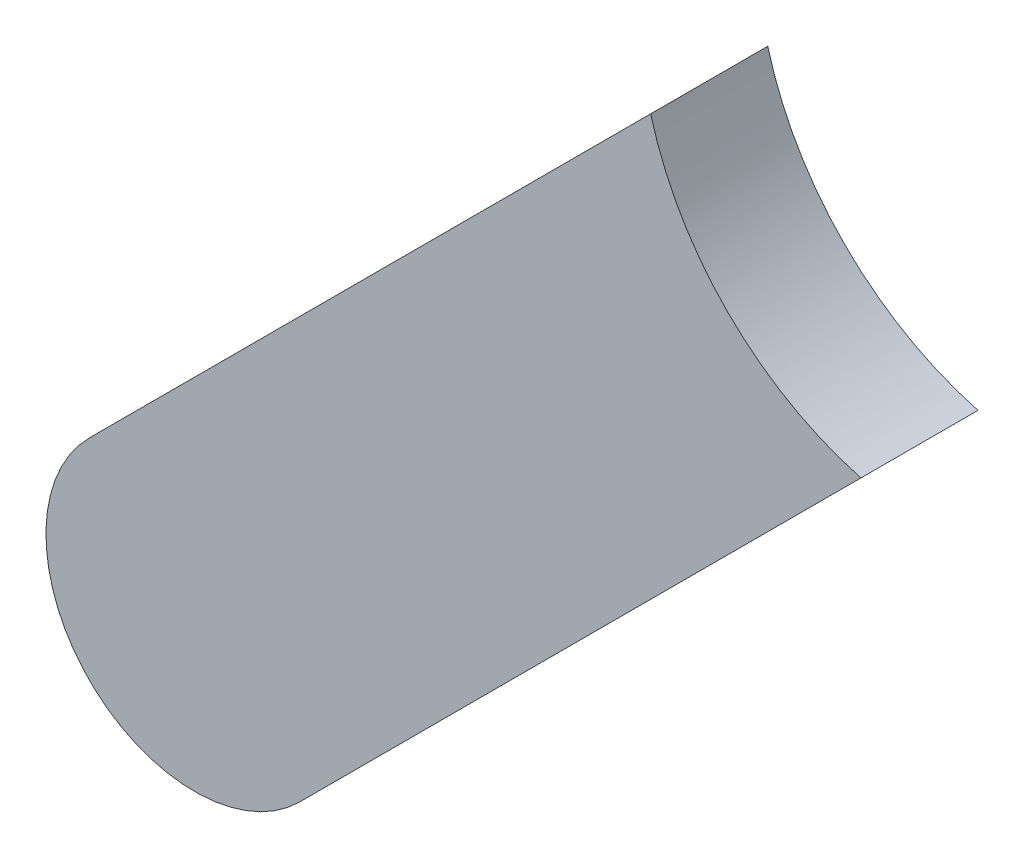
ISO-10303-21;
HEADER;
FILE_DESCRIPTION(('STEP AP214'),'2;1');
FILE_NAME('part.step','',(''),(''),'','','');
FILE_SCHEMA(('AUTOMOTIVE_DESIGN { 1 0 10303 214 1 1 1 1 }'));
ENDSEC;
DATA;
#1=APPLICATION_CONTEXT('core data for automotive mechanical design processes');
#2=APPLICATION_PROTOCOL_DEFINITION('international standard','automotive_design',2000,#1);
#3=PRODUCT_CONTEXT('',#1,'mechanical');
#4=PRODUCT('Part','Part','',(#3));
#5=PRODUCT_RELATED_PRODUCT_CATEGORY('part','',(#4));
#6=PRODUCT_DEFINITION_FORMATION('','',#4);
#7=PRODUCT_DEFINITION_CONTEXT('part definition',#1,'design');
#8=PRODUCT_DEFINITION('design','',#6,#7);
#9=PRODUCT_DEFINITION_SHAPE('','',#8);
#10=(LENGTH_UNIT() NAMED_UNIT(*) SI_UNIT(.MILLI.,.METRE.));
#11=(NAMED_UNIT(*) PLANE_ANGLE_UNIT() SI_UNIT($,.RADIAN.));
#12=(NAMED_UNIT(*) SI_UNIT($,.STERADIAN.) SOLID_ANGLE_UNIT());
#13=UNCERTAINTY_MEASURE_WITH_UNIT(LENGTH_MEASURE(1.E-05),#10,'distance_accuracy_value','');
#14=(GEOMETRIC_REPRESENTATION_CONTEXT(3) GLOBAL_UNCERTAINTY_ASSIGNED_CONTEXT((#13)) GLOBAL_UNIT_ASSIGNED_CONTEXT((#10,
#11,#12)) REPRESENTATION_CONTEXT('',''));
#15=CARTESIAN_POINT('',(0.,0.,0.));
#16=DIRECTION('',(0.,0.,1.));
#17=DIRECTION('',(1.,0.,0.));
#18=AXIS2_PLACEMENT_3D('',#15,#16,#17);
#19=CARTESIAN_POINT('',(151.69060594,59.8913966,0.));
#20=DIRECTION('',(-0.707106781186544,0.707106781186552,0.));
#21=DIRECTION('',(0.707106781186552,0.707106781186544,0.));
#22=AXIS2_PLACEMENT_3D('',#19,#20,#21);
#23=PLANE('',#22);
#24=DIRECTION('',(0.707106781186552,0.707106781186544,0.));
#25=VECTOR('',#24,1.);
#26=CARTESIAN_POINT('',(151.69060594,59.8913966,0.1999996));
#27=LINE('',#26,#25);
#28=CARTESIAN_POINT('',(151.69060594,59.8913966,0.1999996));
#29=VERTEX_POINT('',#28);
#30=CARTESIAN_POINT('',(152.649519211461,60.8503098714614,0.1999996));
#31=VERTEX_POINT('',#30);
#32=EDGE_CURVE('E11',#29,#31,#27,.T.);
#33=ORIENTED_EDGE('',*,*,#32,.F.);
#34=DIRECTION('',(0.,0.,1.));
#35=VECTOR('',#34,1.);
#36=CARTESIAN_POINT('',(151.69060594,59.8913966,0.));
#37=LINE('',#36,#35);
#38=CARTESIAN_POINT('',(151.69060594,59.8913966,0.));
#39=VERTEX_POINT('',#38);
#40=EDGE_CURVE('E24',#39,#29,#37,.T.);
#41=ORIENTED_EDGE('',*,*,#40,.F.);
#42=DIRECTION('',(0.707106781186552,0.707106781186544,0.));
#43=VECTOR('',#42,1.);
#44=CARTESIAN_POINT('',(151.69060594,59.8913966,0.));
#45=LINE('',#44,#43);
#46=CARTESIAN_POINT('',(152.649519211461,60.8503098714614,0.));
#47=VERTEX_POINT('',#46);
#48=EDGE_CURVE('E75',#39,#47,#45,.T.);
#49=ORIENTED_EDGE('',*,*,#48,.T.);
#50=DIRECTION('',(0.,0.,1.));
#51=VECTOR('',#50,1.);
#52=CARTESIAN_POINT('',(152.649519211461,60.8503098714614,0.));
#53=LINE('',#52,#51);
#54=EDGE_CURVE('E37',#47,#31,#53,.T.);
#55=ORIENTED_EDGE('',*,*,#54,.T.);
#56=EDGE_LOOP('',(#33,#41,#49,#55));
#57=FACE_BOUND('',#56,.T.);
#58=ADVANCED_FACE('F17',(#57),#23,.F.);
#59=CARTESIAN_POINT('',(152.781,61.341,0.));
#60=DIRECTION('',(0.,0.,-1.));
#61=DIRECTION('',(1.,0.,0.));
#62=AXIS2_PLACEMENT_3D('',#59,#60,#61);
#63=CYLINDRICAL_SURFACE('',#62,0.508);
#64=DIRECTION('',(0.,0.,1.));
#65=VECTOR('',#64,1.);
#66=CARTESIAN_POINT('',(152.290309871461,61.2095192114614,0.));
#67=LINE('',#66,#65);
#68=CARTESIAN_POINT('',(152.290309871461,61.2095192114614,0.));
#69=VERTEX_POINT('',#68);
#70=CARTESIAN_POINT('',(152.290309871461,61.2095192114614,0.1999996));
#71=VERTEX_POINT('',#70);
#72=EDGE_CURVE('E67',#69,#71,#67,.T.);
#73=ORIENTED_EDGE('',*,*,#72,.T.);
#74=CARTESIAN_POINT('',(152.781,61.341,0.1999996));
#75=DIRECTION('',(0.,0.,1.));
#76=DIRECTION('',(1.,0.,0.));
#77=AXIS2_PLACEMENT_3D('',#74,#75,#76);
#78=CIRCLE('',#77,0.508);
#79=EDGE_CURVE('E82',#71,#31,#78,.T.);
#80=ORIENTED_EDGE('',*,*,#79,.T.);
#81=ORIENTED_EDGE('',*,*,#54,.F.);
#82=CARTESIAN_POINT('',(152.781,61.341,0.));
#83=DIRECTION('',(0.,0.,1.));
#84=DIRECTION('',(1.,0.,0.));
#85=AXIS2_PLACEMENT_3D('',#82,#83,#84);
#86=CIRCLE('',#85,0.508);
#87=EDGE_CURVE('E80',#69,#47,#86,.T.);
#88=ORIENTED_EDGE('',*,*,#87,.F.);
#89=EDGE_LOOP('',(#73,#80,#81,#88));
#90=FACE_BOUND('',#89,.T.);
#91=ADVANCED_FACE('F88',(#90),#63,.F.);
#92=CARTESIAN_POINT('',(152.290309871461,61.2095192114614,0.));
#93=DIRECTION('',(0.707106781186552,-0.707106781186544,0.));
#94=DIRECTION('',(-0.707106781186544,-0.707106781186552,0.));
#95=AXIS2_PLACEMENT_3D('',#92,#93,#94);
#96=PLANE('',#95);
#97=DIRECTION('',(-0.707106781186544,-0.707106781186552,0.));
#98=VECTOR('',#97,1.);
#99=CARTESIAN_POINT('',(152.60139406,61.5206034,0.1999996));
#100=LINE('',#99,#98);
#101=CARTESIAN_POINT('',(151.3313966,60.25060594,0.1999996));
#102=VERTEX_POINT('',#101);
#103=EDGE_CURVE('E71',#71,#102,#100,.T.);
#104=ORIENTED_EDGE('',*,*,#103,.F.);
#105=ORIENTED_EDGE('',*,*,#72,.F.);
#106=DIRECTION('',(-0.707106781186544,-0.707106781186552,0.));
#107=VECTOR('',#106,1.);
#108=CARTESIAN_POINT('',(152.60139406,61.5206034,0.));
#109=LINE('',#108,#107);
#110=CARTESIAN_POINT('',(151.3313966,60.25060594,0.));
#111=VERTEX_POINT('',#110);
#112=EDGE_CURVE('E63',#69,#111,#109,.T.);
#113=ORIENTED_EDGE('',*,*,#112,.T.);
#114=DIRECTION('',(0.,0.,1.));
#115=VECTOR('',#114,1.);
#116=CARTESIAN_POINT('',(151.3313966,60.25060594,0.));
#117=LINE('',#116,#115);
#118=EDGE_CURVE('E53',#111,#102,#117,.T.);
#119=ORIENTED_EDGE('',*,*,#118,.T.);
#120=EDGE_LOOP('',(#104,#105,#113,#119));
#121=FACE_BOUND('',#120,.T.);
#122=ADVANCED_FACE('F66',(#121),#96,.F.);
#123=CARTESIAN_POINT('',(151.51100127,60.07100127,0.));
#124=DIRECTION('',(0.,0.,-1.));
#125=DIRECTION('',(-0.707106781186548,0.707106781186548,0.));
#126=AXIS2_PLACEMENT_3D('',#123,#124,#125);
#127=CYLINDRICAL_SURFACE('',#126,0.253999360179539);
#128=CARTESIAN_POINT('',(151.51100127,60.07100127,0.1999996));
#129=DIRECTION('',(0.,0.,1.));
#130=DIRECTION('',(-0.707106781186548,0.707106781186548,0.));
#131=AXIS2_PLACEMENT_3D('',#128,#129,#130);
#132=CIRCLE('',#131,0.253999360179539);
#133=EDGE_CURVE('E59',#102,#29,#132,.T.);
#134=ORIENTED_EDGE('',*,*,#133,.F.);
#135=ORIENTED_EDGE('',*,*,#118,.F.);
#136=CARTESIAN_POINT('',(151.51100127,60.07100127,0.));
#137=DIRECTION('',(0.,0.,1.));
#138=DIRECTION('',(-0.707106781186548,0.707106781186548,0.));
#139=AXIS2_PLACEMENT_3D('',#136,#137,#138);
#140=CIRCLE('',#139,0.253999360179539);
#141=EDGE_CURVE('E57',#111,#39,#140,.T.);
#142=ORIENTED_EDGE('',*,*,#141,.T.);
#143=ORIENTED_EDGE('',*,*,#40,.T.);
#144=EDGE_LOOP('',(#134,#135,#142,#143));
#145=FACE_BOUND('',#144,.T.);
#146=ADVANCED_FACE('F55',(#145),#127,.T.);
#147=CARTESIAN_POINT('',(151.69060594,59.8913966,0.));
#148=DIRECTION('',(0.,0.,-1.));
#149=DIRECTION('',(-1.,0.,0.));
#150=AXIS2_PLACEMENT_3D('',#147,#148,#149);
#151=PLANE('',#150);
#152=ORIENTED_EDGE('',*,*,#48,.F.);
#153=ORIENTED_EDGE('',*,*,#141,.F.);
#154=ORIENTED_EDGE('',*,*,#112,.F.);
#155=ORIENTED_EDGE('',*,*,#87,.T.);
#156=EDGE_LOOP('',(#152,#153,#154,#155));
#157=FACE_BOUND('',#156,.T.);
#158=ADVANCED_FACE('F74',(#157),#151,.T.);
#159=CARTESIAN_POINT('',(151.69060594,59.8913966,0.1999996));
#160=DIRECTION('',(0.,0.,-1.));
#161=DIRECTION('',(-1.,0.,0.));
#162=AXIS2_PLACEMENT_3D('',#159,#160,#161);
#163=PLANE('',#162);
#164=ORIENTED_EDGE('',*,*,#133,.T.);
#165=ORIENTED_EDGE('',*,*,#32,.T.);
#166=ORIENTED_EDGE('',*,*,#79,.F.);
#167=ORIENTED_EDGE('',*,*,#103,.T.);
#168=EDGE_LOOP('',(#164,#165,#166,#167));
#169=FACE_BOUND('',#168,.T.);
#170=ADVANCED_FACE('F91',(#169),#163,.F.);
#171=CLOSED_SHELL('',(#58,#91,#122,#146,#158,#170));
#172=MANIFOLD_SOLID_BREP('B1',#171);
#173=ADVANCED_BREP_SHAPE_REPRESENTATION('',(#18,#172),#14);
#174=SHAPE_DEFINITION_REPRESENTATION(#9,#173);
ENDSEC;
END-ISO-10303-21;
